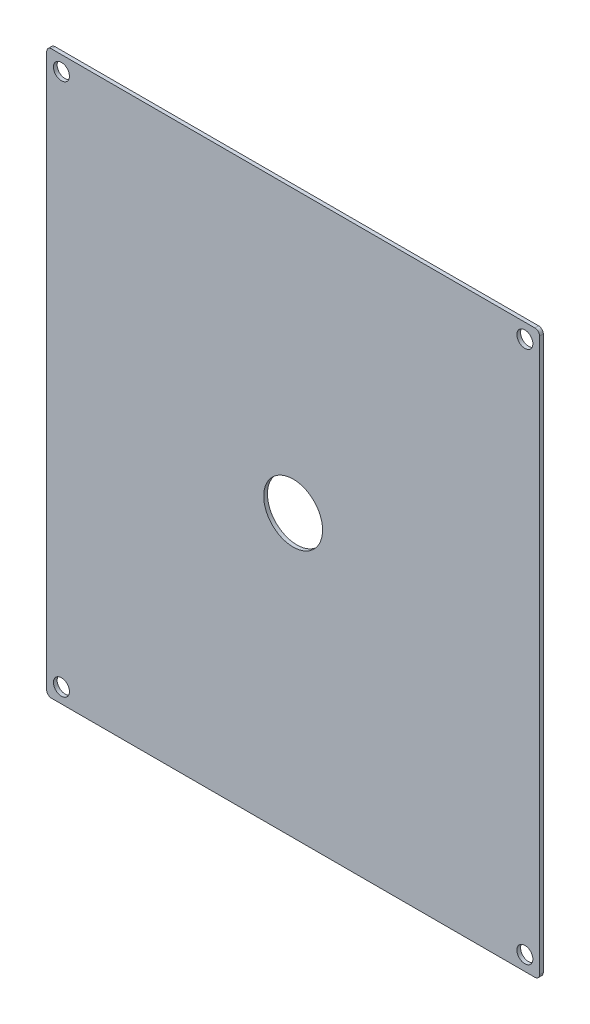
ISO-10303-21;
HEADER;
FILE_DESCRIPTION(('STEP AP214'),'2;1');
FILE_NAME('part.step','',(''),(''),'','','');
FILE_SCHEMA(('AUTOMOTIVE_DESIGN { 1 0 10303 214 1 1 1 1 }'));
ENDSEC;
DATA;
#1=APPLICATION_CONTEXT('core data for automotive mechanical design processes');
#2=APPLICATION_PROTOCOL_DEFINITION('international standard','automotive_design',2000,#1);
#3=PRODUCT_CONTEXT('',#1,'mechanical');
#4=PRODUCT('Part','Part','',(#3));
#5=PRODUCT_RELATED_PRODUCT_CATEGORY('part','',(#4));
#6=PRODUCT_DEFINITION_FORMATION('','',#4);
#7=PRODUCT_DEFINITION_CONTEXT('part definition',#1,'design');
#8=PRODUCT_DEFINITION('design','',#6,#7);
#9=PRODUCT_DEFINITION_SHAPE('','',#8);
#10=(LENGTH_UNIT() NAMED_UNIT(*) SI_UNIT(.MILLI.,.METRE.));
#11=(NAMED_UNIT(*) PLANE_ANGLE_UNIT() SI_UNIT($,.RADIAN.));
#12=(NAMED_UNIT(*) SI_UNIT($,.STERADIAN.) SOLID_ANGLE_UNIT());
#13=UNCERTAINTY_MEASURE_WITH_UNIT(LENGTH_MEASURE(1.E-05),#10,'distance_accuracy_value','');
#14=(GEOMETRIC_REPRESENTATION_CONTEXT(3) GLOBAL_UNCERTAINTY_ASSIGNED_CONTEXT((#13)) GLOBAL_UNIT_ASSIGNED_CONTEXT((#10,
#11,#12)) REPRESENTATION_CONTEXT('',''));
#15=CARTESIAN_POINT('',(0.,0.,0.));
#16=DIRECTION('',(0.,0.,1.));
#17=DIRECTION('',(1.,0.,0.));
#18=AXIS2_PLACEMENT_3D('',#15,#16,#17);
#19=CARTESIAN_POINT('',(0.,0.,0.8));
#20=DIRECTION('',(0.,0.,1.));
#21=DIRECTION('',(1.,0.,0.));
#22=AXIS2_PLACEMENT_3D('',#19,#20,#21);
#23=PLANE('',#22);
#24=CARTESIAN_POINT('',(0.,-115.,0.8));
#25=DIRECTION('',(0.,0.,1.));
#26=DIRECTION('',(1.,0.,0.));
#27=AXIS2_PLACEMENT_3D('',#24,#25,#26);
#28=CIRCLE('',#27,1.725);
#29=CARTESIAN_POINT('',(1.72500000000002,-115.,0.8));
#30=VERTEX_POINT('',#29);
#31=EDGE_CURVE('E200',#30,#30,#28,.T.);
#32=ORIENTED_EDGE('',*,*,#31,.F.);
#33=EDGE_LOOP('',(#32));
#34=FACE_BOUND('',#33,.T.);
#35=CARTESIAN_POINT('',(100.,0.,0.8));
#36=DIRECTION('',(0.,0.,1.));
#37=DIRECTION('',(1.,0.,0.));
#38=AXIS2_PLACEMENT_3D('',#35,#36,#37);
#39=CIRCLE('',#38,1.725);
#40=CARTESIAN_POINT('',(101.725,0.,0.8));
#41=VERTEX_POINT('',#40);
#42=EDGE_CURVE('E188',#41,#41,#39,.T.);
#43=ORIENTED_EDGE('',*,*,#42,.F.);
#44=EDGE_LOOP('',(#43));
#45=FACE_BOUND('',#44,.T.);
#46=DIRECTION('',(0.,-1.,0.));
#47=VECTOR('',#46,1.);
#48=CARTESIAN_POINT('',(-3.175,3.175,0.8));
#49=LINE('',#48,#47);
#50=CARTESIAN_POINT('',(-3.175,2.175,0.8));
#51=VERTEX_POINT('',#50);
#52=CARTESIAN_POINT('',(-3.17499999999999,-117.175,0.8));
#53=VERTEX_POINT('',#52);
#54=EDGE_CURVE('E145',#51,#53,#49,.T.);
#55=ORIENTED_EDGE('',*,*,#54,.T.);
#56=CARTESIAN_POINT('',(-2.17499999999999,-117.175,0.8));
#57=DIRECTION('',(0.,0.,1.));
#58=DIRECTION('',(1.,0.,0.));
#59=AXIS2_PLACEMENT_3D('',#56,#57,#58);
#60=CIRCLE('',#59,1.);
#61=CARTESIAN_POINT('',(-2.17499999999999,-118.175,0.8));
#62=VERTEX_POINT('',#61);
#63=EDGE_CURVE('E160',#53,#62,#60,.T.);
#64=ORIENTED_EDGE('',*,*,#63,.T.);
#65=DIRECTION('',(1.,0.,0.));
#66=VECTOR('',#65,1.);
#67=CARTESIAN_POINT('',(-3.17499999999999,-118.175,0.8));
#68=LINE('',#67,#66);
#69=CARTESIAN_POINT('',(102.175,-118.175,0.8));
#70=VERTEX_POINT('',#69);
#71=EDGE_CURVE('E127',#62,#70,#68,.T.);
#72=ORIENTED_EDGE('',*,*,#71,.T.);
#73=CARTESIAN_POINT('',(102.175,-117.175,0.8));
#74=DIRECTION('',(0.,0.,1.));
#75=DIRECTION('',(1.,0.,0.));
#76=AXIS2_PLACEMENT_3D('',#73,#74,#75);
#77=CIRCLE('',#76,1.);
#78=CARTESIAN_POINT('',(103.175,-117.175,0.8));
#79=VERTEX_POINT('',#78);
#80=EDGE_CURVE('E158',#70,#79,#77,.T.);
#81=ORIENTED_EDGE('',*,*,#80,.T.);
#82=DIRECTION('',(0.,1.,0.));
#83=VECTOR('',#82,1.);
#84=CARTESIAN_POINT('',(103.175,3.175,0.8));
#85=LINE('',#84,#83);
#86=CARTESIAN_POINT('',(103.175,2.175,0.8));
#87=VERTEX_POINT('',#86);
#88=EDGE_CURVE('E171',#79,#87,#85,.T.);
#89=ORIENTED_EDGE('',*,*,#88,.T.);
#90=CARTESIAN_POINT('',(102.175,2.175,0.8));
#91=DIRECTION('',(0.,0.,1.));
#92=DIRECTION('',(1.,0.,0.));
#93=AXIS2_PLACEMENT_3D('',#90,#91,#92);
#94=CIRCLE('',#93,1.);
#95=CARTESIAN_POINT('',(102.175,3.175,0.8));
#96=VERTEX_POINT('',#95);
#97=EDGE_CURVE('E62',#87,#96,#94,.T.);
#98=ORIENTED_EDGE('',*,*,#97,.T.);
#99=DIRECTION('',(-1.,0.,0.));
#100=VECTOR('',#99,1.);
#101=CARTESIAN_POINT('',(-3.175,3.175,0.8));
#102=LINE('',#101,#100);
#103=CARTESIAN_POINT('',(-2.175,3.175,0.8));
#104=VERTEX_POINT('',#103);
#105=EDGE_CURVE('E146',#96,#104,#102,.T.);
#106=ORIENTED_EDGE('',*,*,#105,.T.);
#107=CARTESIAN_POINT('',(-2.175,2.175,0.8));
#108=DIRECTION('',(0.,0.,1.));
#109=DIRECTION('',(1.,0.,0.));
#110=AXIS2_PLACEMENT_3D('',#107,#108,#109);
#111=CIRCLE('',#110,1.);
#112=EDGE_CURVE('E155',#104,#51,#111,.T.);
#113=ORIENTED_EDGE('',*,*,#112,.T.);
#114=EDGE_LOOP('',(#55,#64,#72,#81,#89,#98,#106,#113));
#115=FACE_BOUND('',#114,.T.);
#116=CARTESIAN_POINT('',(0.,0.,0.8));
#117=DIRECTION('',(0.,0.,1.));
#118=DIRECTION('',(1.,0.,0.));
#119=AXIS2_PLACEMENT_3D('',#116,#117,#118);
#120=CIRCLE('',#119,1.725);
#121=CARTESIAN_POINT('',(1.725,0.,0.8));
#122=VERTEX_POINT('',#121);
#123=EDGE_CURVE('E140',#122,#122,#120,.T.);
#124=ORIENTED_EDGE('',*,*,#123,.F.);
#125=EDGE_LOOP('',(#124));
#126=FACE_BOUND('',#125,.T.);
#127=CARTESIAN_POINT('',(100.,-115.,0.8));
#128=DIRECTION('',(0.,0.,1.));
#129=DIRECTION('',(1.,0.,0.));
#130=AXIS2_PLACEMENT_3D('',#127,#128,#129);
#131=CIRCLE('',#130,1.725);
#132=CARTESIAN_POINT('',(101.725,-115.,0.8));
#133=VERTEX_POINT('',#132);
#134=EDGE_CURVE('E194',#133,#133,#131,.T.);
#135=ORIENTED_EDGE('',*,*,#134,.F.);
#136=EDGE_LOOP('',(#135));
#137=FACE_BOUND('',#136,.T.);
#138=CARTESIAN_POINT('',(50.,-57.5,0.8));
#139=DIRECTION('',(0.,0.,1.));
#140=DIRECTION('',(1.,0.,0.));
#141=AXIS2_PLACEMENT_3D('',#138,#139,#140);
#142=CIRCLE('',#141,6.35);
#143=CARTESIAN_POINT('',(56.35,-57.5,0.8));
#144=VERTEX_POINT('',#143);
#145=EDGE_CURVE('E206',#144,#144,#142,.T.);
#146=ORIENTED_EDGE('',*,*,#145,.F.);
#147=EDGE_LOOP('',(#146));
#148=FACE_BOUND('',#147,.T.);
#149=ADVANCED_FACE('F41',(#34,#45,#115,#126,#137,#148),#23,.T.);
#150=CARTESIAN_POINT('',(0.,0.,0.));
#151=DIRECTION('',(0.,0.,1.));
#152=DIRECTION('',(1.,0.,0.));
#153=AXIS2_PLACEMENT_3D('',#150,#151,#152);
#154=PLANE('',#153);
#155=DIRECTION('',(1.,0.,0.));
#156=VECTOR('',#155,1.);
#157=CARTESIAN_POINT('',(-3.17499999999999,-118.175,0.));
#158=LINE('',#157,#156);
#159=CARTESIAN_POINT('',(-2.17499999999999,-118.175,0.));
#160=VERTEX_POINT('',#159);
#161=CARTESIAN_POINT('',(102.175,-118.175,0.));
#162=VERTEX_POINT('',#161);
#163=EDGE_CURVE('E124',#160,#162,#158,.T.);
#164=ORIENTED_EDGE('',*,*,#163,.F.);
#165=CARTESIAN_POINT('',(-2.17499999999999,-117.175,0.));
#166=DIRECTION('',(0.,0.,1.));
#167=DIRECTION('',(1.,0.,0.));
#168=AXIS2_PLACEMENT_3D('',#165,#166,#167);
#169=CIRCLE('',#168,1.);
#170=CARTESIAN_POINT('',(-3.17499999999999,-117.175,0.));
#171=VERTEX_POINT('',#170);
#172=EDGE_CURVE('E107',#160,#171,#169,.F.);
#173=ORIENTED_EDGE('',*,*,#172,.T.);
#174=DIRECTION('',(0.,-1.,0.));
#175=VECTOR('',#174,1.);
#176=CARTESIAN_POINT('',(-3.175,3.175,0.));
#177=LINE('',#176,#175);
#178=CARTESIAN_POINT('',(-3.175,2.175,0.));
#179=VERTEX_POINT('',#178);
#180=EDGE_CURVE('E135',#179,#171,#177,.T.);
#181=ORIENTED_EDGE('',*,*,#180,.F.);
#182=CARTESIAN_POINT('',(-2.175,2.175,0.));
#183=DIRECTION('',(0.,0.,1.));
#184=DIRECTION('',(1.,0.,0.));
#185=AXIS2_PLACEMENT_3D('',#182,#183,#184);
#186=CIRCLE('',#185,1.);
#187=CARTESIAN_POINT('',(-2.175,3.175,0.));
#188=VERTEX_POINT('',#187);
#189=EDGE_CURVE('E128',#179,#188,#186,.F.);
#190=ORIENTED_EDGE('',*,*,#189,.T.);
#191=DIRECTION('',(-1.,0.,0.));
#192=VECTOR('',#191,1.);
#193=CARTESIAN_POINT('',(-3.175,3.175,0.));
#194=LINE('',#193,#192);
#195=CARTESIAN_POINT('',(102.175,3.175,0.));
#196=VERTEX_POINT('',#195);
#197=EDGE_CURVE('E138',#196,#188,#194,.T.);
#198=ORIENTED_EDGE('',*,*,#197,.F.);
#199=CARTESIAN_POINT('',(102.175,2.175,0.));
#200=DIRECTION('',(0.,0.,1.));
#201=DIRECTION('',(1.,0.,0.));
#202=AXIS2_PLACEMENT_3D('',#199,#200,#201);
#203=CIRCLE('',#202,1.);
#204=CARTESIAN_POINT('',(103.175,2.175,0.));
#205=VERTEX_POINT('',#204);
#206=EDGE_CURVE('E149',#196,#205,#203,.F.);
#207=ORIENTED_EDGE('',*,*,#206,.T.);
#208=DIRECTION('',(0.,1.,0.));
#209=VECTOR('',#208,1.);
#210=CARTESIAN_POINT('',(103.175,3.175,0.));
#211=LINE('',#210,#209);
#212=CARTESIAN_POINT('',(103.175,-117.175,0.));
#213=VERTEX_POINT('',#212);
#214=EDGE_CURVE('E134',#213,#205,#211,.T.);
#215=ORIENTED_EDGE('',*,*,#214,.F.);
#216=CARTESIAN_POINT('',(102.175,-117.175,0.));
#217=DIRECTION('',(0.,0.,1.));
#218=DIRECTION('',(1.,0.,0.));
#219=AXIS2_PLACEMENT_3D('',#216,#217,#218);
#220=CIRCLE('',#219,1.);
#221=EDGE_CURVE('E118',#213,#162,#220,.F.);
#222=ORIENTED_EDGE('',*,*,#221,.T.);
#223=EDGE_LOOP('',(#164,#173,#181,#190,#198,#207,#215,#222));
#224=FACE_BOUND('',#223,.T.);
#225=CARTESIAN_POINT('',(0.,0.,0.));
#226=DIRECTION('',(0.,0.,1.));
#227=DIRECTION('',(1.,0.,0.));
#228=AXIS2_PLACEMENT_3D('',#225,#226,#227);
#229=CIRCLE('',#228,1.725);
#230=CARTESIAN_POINT('',(1.725,0.,0.));
#231=VERTEX_POINT('',#230);
#232=EDGE_CURVE('E185',#231,#231,#229,.T.);
#233=ORIENTED_EDGE('',*,*,#232,.T.);
#234=EDGE_LOOP('',(#233));
#235=FACE_BOUND('',#234,.T.);
#236=CARTESIAN_POINT('',(100.,0.,0.));
#237=DIRECTION('',(0.,0.,1.));
#238=DIRECTION('',(1.,0.,0.));
#239=AXIS2_PLACEMENT_3D('',#236,#237,#238);
#240=CIRCLE('',#239,1.725);
#241=CARTESIAN_POINT('',(101.725,0.,0.));
#242=VERTEX_POINT('',#241);
#243=EDGE_CURVE('E191',#242,#242,#240,.T.);
#244=ORIENTED_EDGE('',*,*,#243,.T.);
#245=EDGE_LOOP('',(#244));
#246=FACE_BOUND('',#245,.T.);
#247=CARTESIAN_POINT('',(100.,-115.,0.));
#248=DIRECTION('',(0.,0.,1.));
#249=DIRECTION('',(1.,0.,0.));
#250=AXIS2_PLACEMENT_3D('',#247,#248,#249);
#251=CIRCLE('',#250,1.725);
#252=CARTESIAN_POINT('',(101.725,-115.,0.));
#253=VERTEX_POINT('',#252);
#254=EDGE_CURVE('E197',#253,#253,#251,.T.);
#255=ORIENTED_EDGE('',*,*,#254,.T.);
#256=EDGE_LOOP('',(#255));
#257=FACE_BOUND('',#256,.T.);
#258=CARTESIAN_POINT('',(0.,-115.,0.));
#259=DIRECTION('',(0.,0.,1.));
#260=DIRECTION('',(1.,0.,0.));
#261=AXIS2_PLACEMENT_3D('',#258,#259,#260);
#262=CIRCLE('',#261,1.725);
#263=CARTESIAN_POINT('',(1.72500000000002,-115.,0.));
#264=VERTEX_POINT('',#263);
#265=EDGE_CURVE('E203',#264,#264,#262,.T.);
#266=ORIENTED_EDGE('',*,*,#265,.T.);
#267=EDGE_LOOP('',(#266));
#268=FACE_BOUND('',#267,.T.);
#269=CARTESIAN_POINT('',(50.,-57.5,0.));
#270=DIRECTION('',(0.,0.,1.));
#271=DIRECTION('',(1.,0.,0.));
#272=AXIS2_PLACEMENT_3D('',#269,#270,#271);
#273=CIRCLE('',#272,6.35);
#274=CARTESIAN_POINT('',(56.35,-57.5,0.));
#275=VERTEX_POINT('',#274);
#276=EDGE_CURVE('E209',#275,#275,#273,.T.);
#277=ORIENTED_EDGE('',*,*,#276,.T.);
#278=EDGE_LOOP('',(#277));
#279=FACE_BOUND('',#278,.T.);
#280=ADVANCED_FACE('F131',(#224,#235,#246,#257,#268,#279),#154,.F.);
#281=CARTESIAN_POINT('',(-3.175,3.175,0.8));
#282=DIRECTION('',(1.,0.,0.));
#283=DIRECTION('',(0.,1.,0.));
#284=AXIS2_PLACEMENT_3D('',#281,#282,#283);
#285=PLANE('',#284);
#286=ORIENTED_EDGE('',*,*,#180,.T.);
#287=DIRECTION('',(0.,0.,-1.));
#288=VECTOR('',#287,1.);
#289=CARTESIAN_POINT('',(-3.17499999999999,-117.175,0.8));
#290=LINE('',#289,#288);
#291=EDGE_CURVE('E112',#171,#53,#290,.F.);
#292=ORIENTED_EDGE('',*,*,#291,.T.);
#293=ORIENTED_EDGE('',*,*,#54,.F.);
#294=DIRECTION('',(0.,0.,-1.));
#295=VECTOR('',#294,1.);
#296=CARTESIAN_POINT('',(-3.175,2.175,0.8));
#297=LINE('',#296,#295);
#298=EDGE_CURVE('E117',#51,#179,#297,.T.);
#299=ORIENTED_EDGE('',*,*,#298,.T.);
#300=EDGE_LOOP('',(#286,#292,#293,#299));
#301=FACE_BOUND('',#300,.T.);
#302=ADVANCED_FACE('F224',(#301),#285,.F.);
#303=CARTESIAN_POINT('',(-3.17499999999999,-118.175,0.8));
#304=DIRECTION('',(0.,1.,0.));
#305=DIRECTION('',(0.,0.,1.));
#306=AXIS2_PLACEMENT_3D('',#303,#304,#305);
#307=PLANE('',#306);
#308=ORIENTED_EDGE('',*,*,#71,.F.);
#309=DIRECTION('',(0.,0.,-1.));
#310=VECTOR('',#309,1.);
#311=CARTESIAN_POINT('',(-2.17499999999999,-118.175,0.8));
#312=LINE('',#311,#310);
#313=EDGE_CURVE('E111',#62,#160,#312,.T.);
#314=ORIENTED_EDGE('',*,*,#313,.T.);
#315=ORIENTED_EDGE('',*,*,#163,.T.);
#316=DIRECTION('',(0.,0.,-1.));
#317=VECTOR('',#316,1.);
#318=CARTESIAN_POINT('',(102.175,-118.175,0.8));
#319=LINE('',#318,#317);
#320=EDGE_CURVE('E129',#162,#70,#319,.F.);
#321=ORIENTED_EDGE('',*,*,#320,.T.);
#322=EDGE_LOOP('',(#308,#314,#315,#321));
#323=FACE_BOUND('',#322,.T.);
#324=ADVANCED_FACE('F123',(#323),#307,.F.);
#325=CARTESIAN_POINT('',(103.175,3.175,0.8));
#326=DIRECTION('',(-1.,0.,0.));
#327=DIRECTION('',(0.,-1.,0.));
#328=AXIS2_PLACEMENT_3D('',#325,#326,#327);
#329=PLANE('',#328);
#330=ORIENTED_EDGE('',*,*,#88,.F.);
#331=DIRECTION('',(0.,0.,-1.));
#332=VECTOR('',#331,1.);
#333=CARTESIAN_POINT('',(103.175,-117.175,0.8));
#334=LINE('',#333,#332);
#335=EDGE_CURVE('E164',#79,#213,#334,.T.);
#336=ORIENTED_EDGE('',*,*,#335,.T.);
#337=ORIENTED_EDGE('',*,*,#214,.T.);
#338=DIRECTION('',(0.,0.,-1.));
#339=VECTOR('',#338,1.);
#340=CARTESIAN_POINT('',(103.175,2.175,0.8));
#341=LINE('',#340,#339);
#342=EDGE_CURVE('E162',#205,#87,#341,.F.);
#343=ORIENTED_EDGE('',*,*,#342,.T.);
#344=EDGE_LOOP('',(#330,#336,#337,#343));
#345=FACE_BOUND('',#344,.T.);
#346=ADVANCED_FACE('F169',(#345),#329,.F.);
#347=CARTESIAN_POINT('',(-3.175,3.175,0.8));
#348=DIRECTION('',(0.,-1.,0.));
#349=DIRECTION('',(0.,0.,-1.));
#350=AXIS2_PLACEMENT_3D('',#347,#348,#349);
#351=PLANE('',#350);
#352=ORIENTED_EDGE('',*,*,#105,.F.);
#353=DIRECTION('',(0.,0.,-1.));
#354=VECTOR('',#353,1.);
#355=CARTESIAN_POINT('',(102.175,3.175,0.8));
#356=LINE('',#355,#354);
#357=EDGE_CURVE('E11',#96,#196,#356,.T.);
#358=ORIENTED_EDGE('',*,*,#357,.T.);
#359=ORIENTED_EDGE('',*,*,#197,.T.);
#360=DIRECTION('',(0.,0.,-1.));
#361=VECTOR('',#360,1.);
#362=CARTESIAN_POINT('',(-2.175,3.175,0.8));
#363=LINE('',#362,#361);
#364=EDGE_CURVE('E49',#188,#104,#363,.F.);
#365=ORIENTED_EDGE('',*,*,#364,.T.);
#366=EDGE_LOOP('',(#352,#358,#359,#365));
#367=FACE_BOUND('',#366,.T.);
#368=ADVANCED_FACE('F178',(#367),#351,.F.);
#369=CARTESIAN_POINT('',(0.,0.,0.8));
#370=DIRECTION('',(0.,0.,-1.));
#371=DIRECTION('',(-1.,0.,0.));
#372=AXIS2_PLACEMENT_3D('',#369,#370,#371);
#373=CYLINDRICAL_SURFACE('',#372,1.725);
#374=ORIENTED_EDGE('',*,*,#123,.T.);
#375=EDGE_LOOP('',(#374));
#376=FACE_BOUND('',#375,.T.);
#377=ORIENTED_EDGE('',*,*,#232,.F.);
#378=EDGE_LOOP('',(#377));
#379=FACE_BOUND('',#378,.T.);
#380=ADVANCED_FACE('F229',(#376,#379),#373,.F.);
#381=CARTESIAN_POINT('',(100.,0.,0.8));
#382=DIRECTION('',(0.,0.,-1.));
#383=DIRECTION('',(-1.,0.,0.));
#384=AXIS2_PLACEMENT_3D('',#381,#382,#383);
#385=CYLINDRICAL_SURFACE('',#384,1.725);
#386=ORIENTED_EDGE('',*,*,#42,.T.);
#387=EDGE_LOOP('',(#386));
#388=FACE_BOUND('',#387,.T.);
#389=ORIENTED_EDGE('',*,*,#243,.F.);
#390=EDGE_LOOP('',(#389));
#391=FACE_BOUND('',#390,.T.);
#392=ADVANCED_FACE('F263',(#388,#391),#385,.F.);
#393=CARTESIAN_POINT('',(100.,-115.,0.8));
#394=DIRECTION('',(0.,0.,-1.));
#395=DIRECTION('',(-1.,0.,0.));
#396=AXIS2_PLACEMENT_3D('',#393,#394,#395);
#397=CYLINDRICAL_SURFACE('',#396,1.725);
#398=ORIENTED_EDGE('',*,*,#134,.T.);
#399=EDGE_LOOP('',(#398));
#400=FACE_BOUND('',#399,.T.);
#401=ORIENTED_EDGE('',*,*,#254,.F.);
#402=EDGE_LOOP('',(#401));
#403=FACE_BOUND('',#402,.T.);
#404=ADVANCED_FACE('F259',(#400,#403),#397,.F.);
#405=CARTESIAN_POINT('',(0.,-115.,0.8));
#406=DIRECTION('',(0.,0.,-1.));
#407=DIRECTION('',(-1.,0.,0.));
#408=AXIS2_PLACEMENT_3D('',#405,#406,#407);
#409=CYLINDRICAL_SURFACE('',#408,1.725);
#410=ORIENTED_EDGE('',*,*,#31,.T.);
#411=EDGE_LOOP('',(#410));
#412=FACE_BOUND('',#411,.T.);
#413=ORIENTED_EDGE('',*,*,#265,.F.);
#414=EDGE_LOOP('',(#413));
#415=FACE_BOUND('',#414,.T.);
#416=ADVANCED_FACE('F262',(#412,#415),#409,.F.);
#417=CARTESIAN_POINT('',(50.,-57.5,0.8));
#418=DIRECTION('',(0.,0.,-1.));
#419=DIRECTION('',(-1.,0.,0.));
#420=AXIS2_PLACEMENT_3D('',#417,#418,#419);
#421=CYLINDRICAL_SURFACE('',#420,6.35);
#422=ORIENTED_EDGE('',*,*,#145,.T.);
#423=EDGE_LOOP('',(#422));
#424=FACE_BOUND('',#423,.T.);
#425=ORIENTED_EDGE('',*,*,#276,.F.);
#426=EDGE_LOOP('',(#425));
#427=FACE_BOUND('',#426,.T.);
#428=ADVANCED_FACE('F215',(#424,#427),#421,.F.);
#429=CARTESIAN_POINT('',(-2.17499999999999,-117.175,0.8));
#430=DIRECTION('',(0.,0.,-1.));
#431=DIRECTION('',(-1.,0.,0.));
#432=AXIS2_PLACEMENT_3D('',#429,#430,#431);
#433=CYLINDRICAL_SURFACE('',#432,1.);
#434=ORIENTED_EDGE('',*,*,#63,.F.);
#435=ORIENTED_EDGE('',*,*,#291,.F.);
#436=ORIENTED_EDGE('',*,*,#172,.F.);
#437=ORIENTED_EDGE('',*,*,#313,.F.);
#438=EDGE_LOOP('',(#434,#435,#436,#437));
#439=FACE_BOUND('',#438,.T.);
#440=ADVANCED_FACE('F110',(#439),#433,.T.);
#441=CARTESIAN_POINT('',(102.175,-117.175,0.8));
#442=DIRECTION('',(0.,0.,-1.));
#443=DIRECTION('',(-1.,0.,0.));
#444=AXIS2_PLACEMENT_3D('',#441,#442,#443);
#445=CYLINDRICAL_SURFACE('',#444,1.);
#446=ORIENTED_EDGE('',*,*,#80,.F.);
#447=ORIENTED_EDGE('',*,*,#320,.F.);
#448=ORIENTED_EDGE('',*,*,#221,.F.);
#449=ORIENTED_EDGE('',*,*,#335,.F.);
#450=EDGE_LOOP('',(#446,#447,#448,#449));
#451=FACE_BOUND('',#450,.T.);
#452=ADVANCED_FACE('F243',(#451),#445,.T.);
#453=CARTESIAN_POINT('',(102.175,2.175,0.8));
#454=DIRECTION('',(0.,0.,-1.));
#455=DIRECTION('',(-1.,0.,0.));
#456=AXIS2_PLACEMENT_3D('',#453,#454,#455);
#457=CYLINDRICAL_SURFACE('',#456,1.);
#458=ORIENTED_EDGE('',*,*,#97,.F.);
#459=ORIENTED_EDGE('',*,*,#342,.F.);
#460=ORIENTED_EDGE('',*,*,#206,.F.);
#461=ORIENTED_EDGE('',*,*,#357,.F.);
#462=EDGE_LOOP('',(#458,#459,#460,#461));
#463=FACE_BOUND('',#462,.T.);
#464=ADVANCED_FACE('F177',(#463),#457,.T.);
#465=CARTESIAN_POINT('',(-2.175,2.175,0.8));
#466=DIRECTION('',(0.,0.,-1.));
#467=DIRECTION('',(-1.,0.,0.));
#468=AXIS2_PLACEMENT_3D('',#465,#466,#467);
#469=CYLINDRICAL_SURFACE('',#468,1.);
#470=ORIENTED_EDGE('',*,*,#112,.F.);
#471=ORIENTED_EDGE('',*,*,#364,.F.);
#472=ORIENTED_EDGE('',*,*,#189,.F.);
#473=ORIENTED_EDGE('',*,*,#298,.F.);
#474=EDGE_LOOP('',(#470,#471,#472,#473));
#475=FACE_BOUND('',#474,.T.);
#476=ADVANCED_FACE('F43',(#475),#469,.T.);
#477=CLOSED_SHELL('',(#149,#280,#302,#324,#346,#368,#380,#392,#404,#416,#428,#440,#452,#464,#476));
#478=MANIFOLD_SOLID_BREP('B2',#477);
#479=ADVANCED_BREP_SHAPE_REPRESENTATION('',(#18,#478),#14);
#480=SHAPE_DEFINITION_REPRESENTATION(#9,#479);
ENDSEC;
END-ISO-10303-21;
